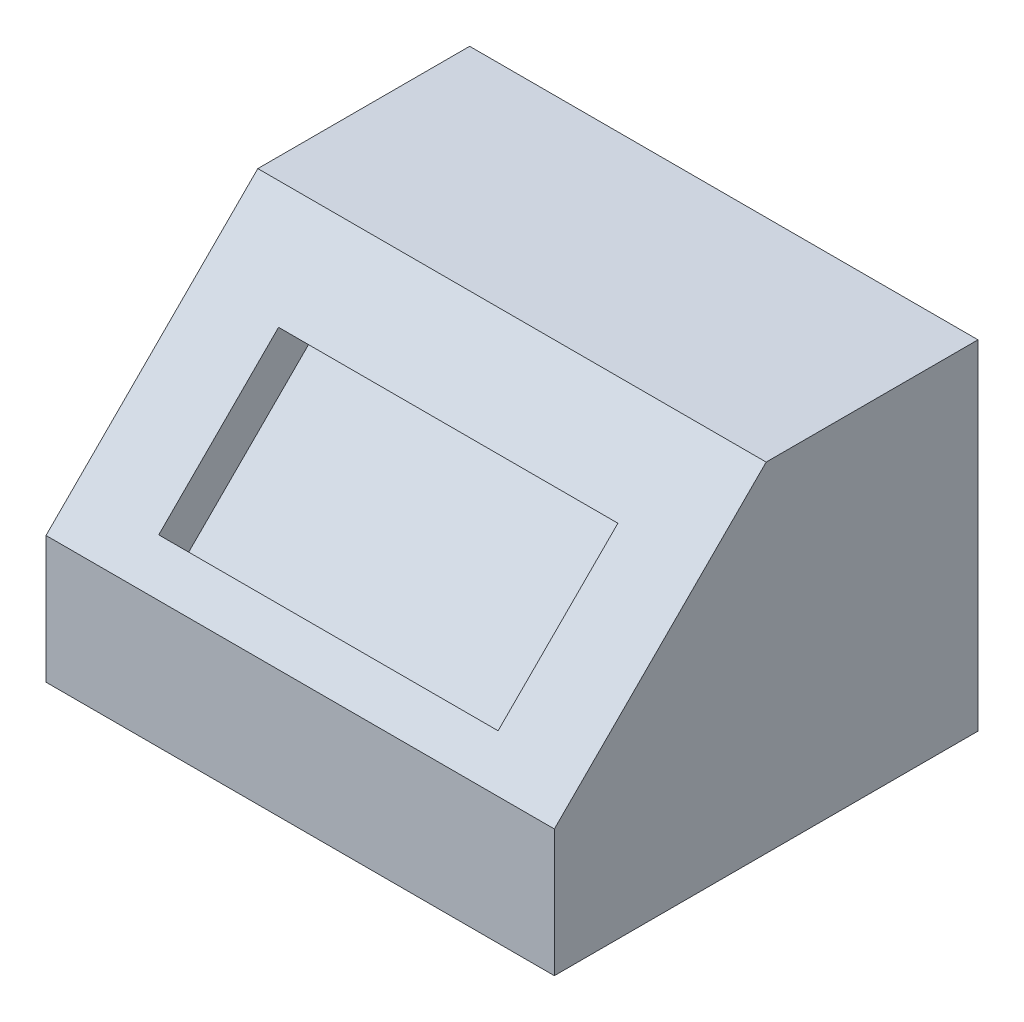
ISO-10303-21;
HEADER;
FILE_DESCRIPTION(('STEP AP214'),'2;1');
FILE_NAME('part.step','',(''),(''),'','','');
FILE_SCHEMA(('AUTOMOTIVE_DESIGN { 1 0 10303 214 1 1 1 1 }'));
ENDSEC;
DATA;
#1=APPLICATION_CONTEXT('core data for automotive mechanical design processes');
#2=APPLICATION_PROTOCOL_DEFINITION('international standard','automotive_design',2000,#1);
#3=PRODUCT_CONTEXT('',#1,'mechanical');
#4=PRODUCT('Part','Part','',(#3));
#5=PRODUCT_RELATED_PRODUCT_CATEGORY('part','',(#4));
#6=PRODUCT_DEFINITION_FORMATION('','',#4);
#7=PRODUCT_DEFINITION_CONTEXT('part definition',#1,'design');
#8=PRODUCT_DEFINITION('design','',#6,#7);
#9=PRODUCT_DEFINITION_SHAPE('','',#8);
#10=(LENGTH_UNIT() NAMED_UNIT(*) SI_UNIT(.MILLI.,.METRE.));
#11=(NAMED_UNIT(*) PLANE_ANGLE_UNIT() SI_UNIT($,.RADIAN.));
#12=(NAMED_UNIT(*) SI_UNIT($,.STERADIAN.) SOLID_ANGLE_UNIT());
#13=UNCERTAINTY_MEASURE_WITH_UNIT(LENGTH_MEASURE(1.E-05),#10,'distance_accuracy_value','');
#14=(GEOMETRIC_REPRESENTATION_CONTEXT(3) GLOBAL_UNCERTAINTY_ASSIGNED_CONTEXT((#13)) GLOBAL_UNIT_ASSIGNED_CONTEXT((#10,
#11,#12)) REPRESENTATION_CONTEXT('',''));
#15=CARTESIAN_POINT('',(0.,0.,0.));
#16=DIRECTION('',(0.,0.,1.));
#17=DIRECTION('',(1.,0.,0.));
#18=AXIS2_PLACEMENT_3D('',#15,#16,#17);
#19=CARTESIAN_POINT('',(28.717503372547,30.8114879934619,-127.));
#20=DIRECTION('',(1.,0.,0.));
#21=DIRECTION('',(0.,0.,-1.));
#22=AXIS2_PLACEMENT_3D('',#19,#20,#21);
#23=PLANE('',#22);
#24=DIRECTION('',(0.,0.,1.));
#25=VECTOR('',#24,1.);
#26=CARTESIAN_POINT('',(28.717503372547,30.8114879934619,-127.));
#27=LINE('',#26,#25);
#28=CARTESIAN_POINT('',(28.717503372547,30.8114879934619,-127.));
#29=VERTEX_POINT('',#28);
#30=CARTESIAN_POINT('',(28.717503372547,30.8114879934619,-63.5));
#31=VERTEX_POINT('',#30);
#32=EDGE_CURVE('E82',#29,#31,#27,.T.);
#33=ORIENTED_EDGE('',*,*,#32,.T.);
#34=DIRECTION('',(0.,-0.707106781186548,0.707106781186547));
#35=VECTOR('',#34,1.);
#36=CARTESIAN_POINT('',(28.717503372547,62.561487993462,-95.25));
#37=LINE('',#36,#35);
#38=CARTESIAN_POINT('',(28.717503372547,-32.6885120065381,0.));
#39=VERTEX_POINT('',#38);
#40=EDGE_CURVE('E152',#31,#39,#37,.T.);
#41=ORIENTED_EDGE('',*,*,#40,.T.);
#42=DIRECTION('',(0.,1.,0.));
#43=VECTOR('',#42,1.);
#44=CARTESIAN_POINT('',(28.717503372547,30.8114879934619,0.));
#45=LINE('',#44,#43);
#46=CARTESIAN_POINT('',(28.717503372547,-70.7885120065381,0.));
#47=VERTEX_POINT('',#46);
#48=EDGE_CURVE('E155',#47,#39,#45,.T.);
#49=ORIENTED_EDGE('',*,*,#48,.F.);
#50=DIRECTION('',(0.,0.,1.));
#51=VECTOR('',#50,1.);
#52=CARTESIAN_POINT('',(28.717503372547,-70.7885120065381,-127.));
#53=LINE('',#52,#51);
#54=CARTESIAN_POINT('',(28.717503372547,-70.7885120065381,-127.));
#55=VERTEX_POINT('',#54);
#56=EDGE_CURVE('E46',#55,#47,#53,.T.);
#57=ORIENTED_EDGE('',*,*,#56,.F.);
#58=DIRECTION('',(0.,1.,0.));
#59=VECTOR('',#58,1.);
#60=CARTESIAN_POINT('',(28.717503372547,30.8114879934619,-127.));
#61=LINE('',#60,#59);
#62=EDGE_CURVE('E156',#55,#29,#61,.T.);
#63=ORIENTED_EDGE('',*,*,#62,.T.);
#64=EDGE_LOOP('',(#33,#41,#49,#57,#63));
#65=FACE_BOUND('',#64,.T.);
#66=ADVANCED_FACE('F39',(#65),#23,.T.);
#67=CARTESIAN_POINT('',(28.717503372547,30.8114879934619,-127.));
#68=DIRECTION('',(0.,1.,0.));
#69=DIRECTION('',(0.,0.,1.));
#70=AXIS2_PLACEMENT_3D('',#67,#68,#69);
#71=PLANE('',#70);
#72=DIRECTION('',(0.,0.,1.));
#73=VECTOR('',#72,1.);
#74=CARTESIAN_POINT('',(-123.682496627453,30.8114879934619,-127.));
#75=LINE('',#74,#73);
#76=CARTESIAN_POINT('',(-123.682496627453,30.8114879934619,-127.));
#77=VERTEX_POINT('',#76);
#78=CARTESIAN_POINT('',(-123.682496627453,30.8114879934619,-63.5));
#79=VERTEX_POINT('',#78);
#80=EDGE_CURVE('E176',#77,#79,#75,.T.);
#81=ORIENTED_EDGE('',*,*,#80,.T.);
#82=DIRECTION('',(-1.,0.,0.));
#83=VECTOR('',#82,1.);
#84=CARTESIAN_POINT('',(134.62,30.8114879934619,-63.5));
#85=LINE('',#84,#83);
#86=EDGE_CURVE('E146',#31,#79,#85,.T.);
#87=ORIENTED_EDGE('',*,*,#86,.F.);
#88=ORIENTED_EDGE('',*,*,#32,.F.);
#89=DIRECTION('',(-1.,0.,0.));
#90=VECTOR('',#89,1.);
#91=CARTESIAN_POINT('',(28.717503372547,30.8114879934619,-127.));
#92=LINE('',#91,#90);
#93=EDGE_CURVE('E158',#29,#77,#92,.T.);
#94=ORIENTED_EDGE('',*,*,#93,.T.);
#95=EDGE_LOOP('',(#81,#87,#88,#94));
#96=FACE_BOUND('',#95,.T.);
#97=ADVANCED_FACE('F187',(#96),#71,.T.);
#98=CARTESIAN_POINT('',(0.,0.,0.));
#99=DIRECTION('',(0.,0.,-1.));
#100=DIRECTION('',(-1.,0.,0.));
#101=AXIS2_PLACEMENT_3D('',#98,#99,#100);
#102=PLANE('',#101);
#103=DIRECTION('',(1.,0.,0.));
#104=VECTOR('',#103,1.);
#105=CARTESIAN_POINT('',(0.,-32.6885120065381,0.));
#106=LINE('',#105,#104);
#107=CARTESIAN_POINT('',(-123.682496627453,-32.6885120065381,0.));
#108=VERTEX_POINT('',#107);
#109=EDGE_CURVE('E11',#108,#39,#106,.T.);
#110=ORIENTED_EDGE('',*,*,#109,.F.);
#111=DIRECTION('',(0.,-1.,0.));
#112=VECTOR('',#111,1.);
#113=CARTESIAN_POINT('',(-123.682496627453,30.8114879934619,0.));
#114=LINE('',#113,#112);
#115=CARTESIAN_POINT('',(-123.682496627453,-70.7885120065381,0.));
#116=VERTEX_POINT('',#115);
#117=EDGE_CURVE('E168',#108,#116,#114,.T.);
#118=ORIENTED_EDGE('',*,*,#117,.T.);
#119=DIRECTION('',(1.,0.,0.));
#120=VECTOR('',#119,1.);
#121=CARTESIAN_POINT('',(28.717503372547,-70.7885120065381,0.));
#122=LINE('',#121,#120);
#123=EDGE_CURVE('E159',#116,#47,#122,.T.);
#124=ORIENTED_EDGE('',*,*,#123,.T.);
#125=ORIENTED_EDGE('',*,*,#48,.T.);
#126=EDGE_LOOP('',(#110,#118,#124,#125));
#127=FACE_BOUND('',#126,.T.);
#128=ADVANCED_FACE('F191',(#127),#102,.F.);
#129=CARTESIAN_POINT('',(28.717503372547,-70.7885120065381,-127.));
#130=DIRECTION('',(0.,-1.,0.));
#131=DIRECTION('',(0.,0.,-1.));
#132=AXIS2_PLACEMENT_3D('',#129,#130,#131);
#133=PLANE('',#132);
#134=ORIENTED_EDGE('',*,*,#123,.F.);
#135=DIRECTION('',(0.,0.,1.));
#136=VECTOR('',#135,1.);
#137=CARTESIAN_POINT('',(-123.682496627453,-70.7885120065381,-127.));
#138=LINE('',#137,#136);
#139=CARTESIAN_POINT('',(-123.682496627453,-70.7885120065381,-127.));
#140=VERTEX_POINT('',#139);
#141=EDGE_CURVE('E173',#140,#116,#138,.T.);
#142=ORIENTED_EDGE('',*,*,#141,.F.);
#143=DIRECTION('',(1.,0.,0.));
#144=VECTOR('',#143,1.);
#145=CARTESIAN_POINT('',(28.717503372547,-70.7885120065381,-127.));
#146=LINE('',#145,#144);
#147=EDGE_CURVE('E164',#140,#55,#146,.T.);
#148=ORIENTED_EDGE('',*,*,#147,.T.);
#149=ORIENTED_EDGE('',*,*,#56,.T.);
#150=EDGE_LOOP('',(#134,#142,#148,#149));
#151=FACE_BOUND('',#150,.T.);
#152=ADVANCED_FACE('F182',(#151),#133,.T.);
#153=CARTESIAN_POINT('',(-123.682496627453,30.8114879934619,-127.));
#154=DIRECTION('',(-1.,0.,0.));
#155=DIRECTION('',(0.,0.,1.));
#156=AXIS2_PLACEMENT_3D('',#153,#154,#155);
#157=PLANE('',#156);
#158=DIRECTION('',(0.,-0.707106781186548,0.707106781186547));
#159=VECTOR('',#158,1.);
#160=CARTESIAN_POINT('',(-123.682496627453,62.5614879934619,-95.25));
#161=LINE('',#160,#159);
#162=EDGE_CURVE('E142',#79,#108,#161,.T.);
#163=ORIENTED_EDGE('',*,*,#162,.F.);
#164=ORIENTED_EDGE('',*,*,#80,.F.);
#165=DIRECTION('',(0.,-1.,0.));
#166=VECTOR('',#165,1.);
#167=CARTESIAN_POINT('',(-123.682496627453,30.8114879934619,-127.));
#168=LINE('',#167,#166);
#169=EDGE_CURVE('E161',#77,#140,#168,.T.);
#170=ORIENTED_EDGE('',*,*,#169,.T.);
#171=ORIENTED_EDGE('',*,*,#141,.T.);
#172=ORIENTED_EDGE('',*,*,#117,.F.);
#173=EDGE_LOOP('',(#163,#164,#170,#171,#172));
#174=FACE_BOUND('',#173,.T.);
#175=ADVANCED_FACE('F186',(#174),#157,.T.);
#176=CARTESIAN_POINT('',(0.,0.,-127.));
#177=DIRECTION('',(0.,0.,-1.));
#178=DIRECTION('',(-1.,0.,0.));
#179=AXIS2_PLACEMENT_3D('',#176,#177,#178);
#180=PLANE('',#179);
#181=ORIENTED_EDGE('',*,*,#62,.F.);
#182=ORIENTED_EDGE('',*,*,#147,.F.);
#183=ORIENTED_EDGE('',*,*,#169,.F.);
#184=ORIENTED_EDGE('',*,*,#93,.F.);
#185=EDGE_LOOP('',(#181,#182,#183,#184));
#186=FACE_BOUND('',#185,.T.);
#187=ADVANCED_FACE('F180',(#186),#180,.T.);
#188=CARTESIAN_POINT('',(134.62,-32.6885120065381,0.));
#189=DIRECTION('',(0.,0.707106781186547,0.707106781186548));
#190=DIRECTION('',(0.,-0.707106781186548,0.707106781186547));
#191=AXIS2_PLACEMENT_3D('',#188,#189,#190);
#192=PLANE('',#191);
#193=DIRECTION('',(-1.,0.,0.));
#194=VECTOR('',#193,1.);
#195=CARTESIAN_POINT('',(-98.4149896408265,-24.1595364908151,-8.52897551572293));
#196=LINE('',#195,#194);
#197=CARTESIAN_POINT('',(3.31750337254699,-24.1595364908151,-8.52897551572293));
#198=VERTEX_POINT('',#197);
#199=CARTESIAN_POINT('',(-98.4149896408265,-24.1595364908151,-8.52897551572293));
#200=VERTEX_POINT('',#199);
#201=EDGE_CURVE('E299',#198,#200,#196,.T.);
#202=ORIENTED_EDGE('',*,*,#201,.T.);
#203=DIRECTION('',(0.,0.707106781186551,-0.707106781186544));
#204=VECTOR('',#203,1.);
#205=CARTESIAN_POINT('',(-98.4149896408265,-24.1595364908151,-8.52897551572293));
#206=LINE('',#205,#204);
#207=CARTESIAN_POINT('',(-98.4149896408265,11.7614879934617,-44.4499999999993));
#208=VERTEX_POINT('',#207);
#209=EDGE_CURVE('E137',#200,#208,#206,.T.);
#210=ORIENTED_EDGE('',*,*,#209,.T.);
#211=DIRECTION('',(-1.,0.,0.));
#212=VECTOR('',#211,1.);
#213=CARTESIAN_POINT('',(-98.4149896408265,11.7614879934617,-44.4499999999993));
#214=LINE('',#213,#212);
#215=CARTESIAN_POINT('',(3.31750337254699,11.7614879934615,-44.4499999999996));
#216=VERTEX_POINT('',#215);
#217=EDGE_CURVE('E138',#216,#208,#214,.T.);
#218=ORIENTED_EDGE('',*,*,#217,.F.);
#219=DIRECTION('',(0.,0.707106781186551,-0.707106781186544));
#220=VECTOR('',#219,1.);
#221=CARTESIAN_POINT('',(3.31750337254699,-24.1595364908151,-8.52897551572293));
#222=LINE('',#221,#220);
#223=EDGE_CURVE('E53',#198,#216,#222,.T.);
#224=ORIENTED_EDGE('',*,*,#223,.F.);
#225=EDGE_LOOP('',(#202,#210,#218,#224));
#226=FACE_BOUND('',#225,.T.);
#227=ORIENTED_EDGE('',*,*,#86,.T.);
#228=ORIENTED_EDGE('',*,*,#162,.T.);
#229=ORIENTED_EDGE('',*,*,#109,.T.);
#230=ORIENTED_EDGE('',*,*,#40,.F.);
#231=EDGE_LOOP('',(#227,#228,#229,#230));
#232=FACE_BOUND('',#231,.T.);
#233=ADVANCED_FACE('F189',(#226,#232),#192,.T.);
#234=CARTESIAN_POINT('',(-98.4149896408265,-24.1595364908151,-8.52897551572293));
#235=DIRECTION('',(1.,0.,0.));
#236=DIRECTION('',(0.,0.,-1.));
#237=AXIS2_PLACEMENT_3D('',#234,#235,#236);
#238=PLANE('',#237);
#239=DIRECTION('',(0.,-0.707106781186544,-0.707106781186551));
#240=VECTOR('',#239,1.);
#241=CARTESIAN_POINT('',(-98.4149896408265,11.7614879934617,-44.4499999999993));
#242=LINE('',#241,#240);
#243=CARTESIAN_POINT('',(-98.4149896408265,2.78123187239263,-53.4302561210685));
#244=VERTEX_POINT('',#243);
#245=EDGE_CURVE('E293',#208,#244,#242,.T.);
#246=ORIENTED_EDGE('',*,*,#245,.F.);
#247=ORIENTED_EDGE('',*,*,#209,.F.);
#248=DIRECTION('',(0.,-0.707106781186544,-0.707106781186551));
#249=VECTOR('',#248,1.);
#250=CARTESIAN_POINT('',(-98.4149896408265,-24.1595364908151,-8.52897551572293));
#251=LINE('',#250,#249);
#252=CARTESIAN_POINT('',(-98.4149896408265,-33.1397926118842,-17.5092316367921));
#253=VERTEX_POINT('',#252);
#254=EDGE_CURVE('E122',#200,#253,#251,.T.);
#255=ORIENTED_EDGE('',*,*,#254,.T.);
#256=DIRECTION('',(0.,0.707106781186551,-0.707106781186544));
#257=VECTOR('',#256,1.);
#258=CARTESIAN_POINT('',(-98.4149896408265,-33.1397926118842,-17.5092316367921));
#259=LINE('',#258,#257);
#260=EDGE_CURVE('E134',#253,#244,#259,.T.);
#261=ORIENTED_EDGE('',*,*,#260,.T.);
#262=EDGE_LOOP('',(#246,#247,#255,#261));
#263=FACE_BOUND('',#262,.T.);
#264=ADVANCED_FACE('F133',(#263),#238,.T.);
#265=CARTESIAN_POINT('',(-98.4149896408265,-33.1397926118842,-17.5092316367921));
#266=DIRECTION('',(0.,0.707106781186544,0.707106781186551));
#267=DIRECTION('',(0.,-0.707106781186551,0.707106781186544));
#268=AXIS2_PLACEMENT_3D('',#265,#266,#267);
#269=PLANE('',#268);
#270=DIRECTION('',(1.,0.,0.));
#271=VECTOR('',#270,1.);
#272=CARTESIAN_POINT('',(-98.4149896408265,2.78123187239263,-53.4302561210685));
#273=LINE('',#272,#271);
#274=CARTESIAN_POINT('',(3.31750337254699,2.78123187239263,-53.4302561210685));
#275=VERTEX_POINT('',#274);
#276=EDGE_CURVE('E141',#244,#275,#273,.T.);
#277=ORIENTED_EDGE('',*,*,#276,.F.);
#278=ORIENTED_EDGE('',*,*,#260,.F.);
#279=DIRECTION('',(1.,0.,0.));
#280=VECTOR('',#279,1.);
#281=CARTESIAN_POINT('',(-98.4149896408265,-33.1397926118842,-17.5092316367921));
#282=LINE('',#281,#280);
#283=CARTESIAN_POINT('',(3.31750337254699,-33.1397926118842,-17.5092316367921));
#284=VERTEX_POINT('',#283);
#285=EDGE_CURVE('E118',#253,#284,#282,.T.);
#286=ORIENTED_EDGE('',*,*,#285,.T.);
#287=DIRECTION('',(0.,0.707106781186551,-0.707106781186544));
#288=VECTOR('',#287,1.);
#289=CARTESIAN_POINT('',(3.31750337254699,-33.1397926118842,-17.5092316367921));
#290=LINE('',#289,#288);
#291=EDGE_CURVE('E143',#284,#275,#290,.T.);
#292=ORIENTED_EDGE('',*,*,#291,.T.);
#293=EDGE_LOOP('',(#277,#278,#286,#292));
#294=FACE_BOUND('',#293,.T.);
#295=ADVANCED_FACE('F140',(#294),#269,.T.);
#296=CARTESIAN_POINT('',(3.31750337254699,-24.1595364908151,-8.52897551572293));
#297=DIRECTION('',(-1.,0.,0.));
#298=DIRECTION('',(0.,0.,1.));
#299=AXIS2_PLACEMENT_3D('',#296,#297,#298);
#300=PLANE('',#299);
#301=DIRECTION('',(0.,0.707106781186544,0.707106781186551));
#302=VECTOR('',#301,1.);
#303=CARTESIAN_POINT('',(3.31750337254699,11.7614879934617,-44.4499999999993));
#304=LINE('',#303,#302);
#305=EDGE_CURVE('E296',#275,#216,#304,.T.);
#306=ORIENTED_EDGE('',*,*,#305,.F.);
#307=ORIENTED_EDGE('',*,*,#291,.F.);
#308=DIRECTION('',(0.,0.707106781186544,0.707106781186551));
#309=VECTOR('',#308,1.);
#310=CARTESIAN_POINT('',(3.31750337254699,-24.1595364908151,-8.52897551572293));
#311=LINE('',#310,#309);
#312=EDGE_CURVE('E124',#284,#198,#311,.T.);
#313=ORIENTED_EDGE('',*,*,#312,.T.);
#314=ORIENTED_EDGE('',*,*,#223,.T.);
#315=EDGE_LOOP('',(#306,#307,#313,#314));
#316=FACE_BOUND('',#315,.T.);
#317=ADVANCED_FACE('F256',(#316),#300,.T.);
#318=CARTESIAN_POINT('',(0.,-7.8152804875462,7.8152804875461));
#319=DIRECTION('',(0.,-0.707106781186551,0.707106781186544));
#320=DIRECTION('',(0.,-0.707106781186544,-0.707106781186551));
#321=AXIS2_PLACEMENT_3D('',#318,#319,#320);
#322=PLANE('',#321);
#323=ORIENTED_EDGE('',*,*,#254,.F.);
#324=ORIENTED_EDGE('',*,*,#201,.F.);
#325=ORIENTED_EDGE('',*,*,#312,.F.);
#326=ORIENTED_EDGE('',*,*,#285,.F.);
#327=EDGE_LOOP('',(#323,#324,#325,#326));
#328=FACE_BOUND('',#327,.T.);
#329=ADVANCED_FACE('F120',(#328),#322,.F.);
#330=CARTESIAN_POINT('',(0.,28.1057439967306,-28.1057439967303));
#331=DIRECTION('',(0.,-0.707106781186551,0.707106781186544));
#332=DIRECTION('',(0.,-0.707106781186544,-0.707106781186551));
#333=AXIS2_PLACEMENT_3D('',#330,#331,#332);
#334=PLANE('',#333);
#335=ORIENTED_EDGE('',*,*,#245,.T.);
#336=ORIENTED_EDGE('',*,*,#276,.T.);
#337=ORIENTED_EDGE('',*,*,#305,.T.);
#338=ORIENTED_EDGE('',*,*,#217,.T.);
#339=EDGE_LOOP('',(#335,#336,#337,#338));
#340=FACE_BOUND('',#339,.T.);
#341=ADVANCED_FACE('F271',(#340),#334,.T.);
#342=CLOSED_SHELL('',(#66,#97,#128,#152,#175,#187,#233,#264,#295,#317,#329,#341));
#343=MANIFOLD_SOLID_BREP('B2',#342);
#344=ADVANCED_BREP_SHAPE_REPRESENTATION('',(#18,#343),#14);
#345=SHAPE_DEFINITION_REPRESENTATION(#9,#344);
ENDSEC;
END-ISO-10303-21;
